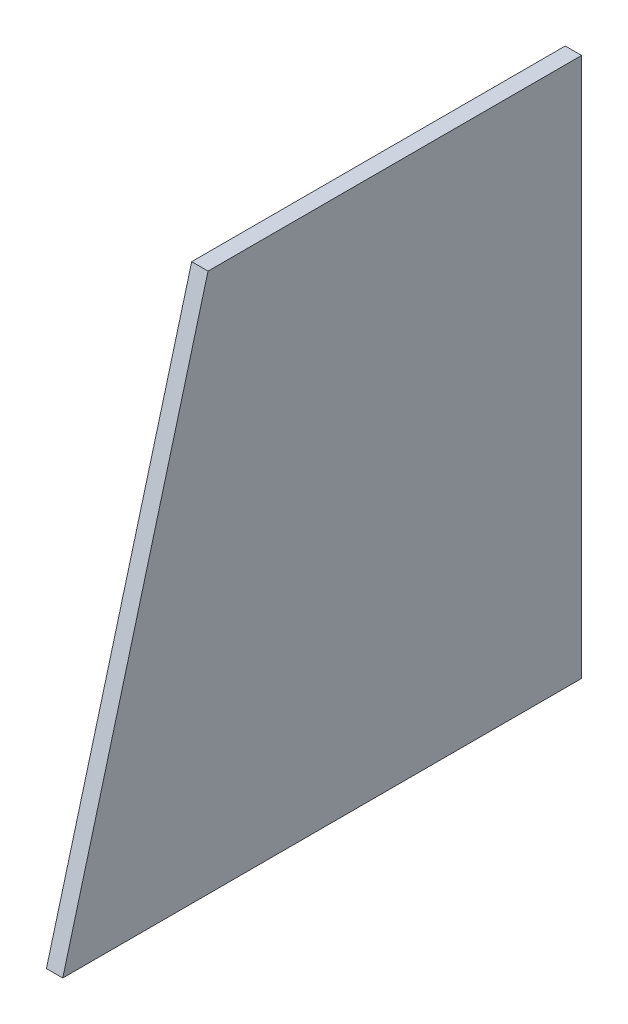
ISO-10303-21;
HEADER;
FILE_DESCRIPTION(('STEP AP214'),'2;1');
FILE_NAME('part.step','',(''),(''),'','','');
FILE_SCHEMA(('AUTOMOTIVE_DESIGN { 1 0 10303 214 1 1 1 1 }'));
ENDSEC;
DATA;
#1=APPLICATION_CONTEXT('core data for automotive mechanical design processes');
#2=APPLICATION_PROTOCOL_DEFINITION('international standard','automotive_design',2000,#1);
#3=PRODUCT_CONTEXT('',#1,'mechanical');
#4=PRODUCT('Part','Part','',(#3));
#5=PRODUCT_RELATED_PRODUCT_CATEGORY('part','',(#4));
#6=PRODUCT_DEFINITION_FORMATION('','',#4);
#7=PRODUCT_DEFINITION_CONTEXT('part definition',#1,'design');
#8=PRODUCT_DEFINITION('design','',#6,#7);
#9=PRODUCT_DEFINITION_SHAPE('','',#8);
#10=(LENGTH_UNIT() NAMED_UNIT(*) SI_UNIT(.MILLI.,.METRE.));
#11=(NAMED_UNIT(*) PLANE_ANGLE_UNIT() SI_UNIT($,.RADIAN.));
#12=(NAMED_UNIT(*) SI_UNIT($,.STERADIAN.) SOLID_ANGLE_UNIT());
#13=UNCERTAINTY_MEASURE_WITH_UNIT(LENGTH_MEASURE(1.E-05),#10,'distance_accuracy_value','');
#14=(GEOMETRIC_REPRESENTATION_CONTEXT(3) GLOBAL_UNCERTAINTY_ASSIGNED_CONTEXT((#13)) GLOBAL_UNIT_ASSIGNED_CONTEXT((#10,
#11,#12)) REPRESENTATION_CONTEXT('',''));
#15=CARTESIAN_POINT('',(0.,0.,0.));
#16=DIRECTION('',(0.,0.,1.));
#17=DIRECTION('',(1.,0.,0.));
#18=AXIS2_PLACEMENT_3D('',#15,#16,#17);
#19=CARTESIAN_POINT('',(5.,0.,-158.75));
#20=DIRECTION('',(0.,-1.,0.));
#21=DIRECTION('',(0.,0.,-1.));
#22=AXIS2_PLACEMENT_3D('',#19,#20,#21);
#23=PLANE('',#22);
#24=DIRECTION('',(0.,0.,1.));
#25=VECTOR('',#24,1.);
#26=CARTESIAN_POINT('',(0.,0.,-158.75));
#27=LINE('',#26,#25);
#28=CARTESIAN_POINT('',(0.,0.,-158.75));
#29=VERTEX_POINT('',#28);
#30=CARTESIAN_POINT('',(0.,0.,0.));
#31=VERTEX_POINT('',#30);
#32=EDGE_CURVE('E109',#29,#31,#27,.T.);
#33=ORIENTED_EDGE('',*,*,#32,.F.);
#34=DIRECTION('',(-1.,0.,0.));
#35=VECTOR('',#34,1.);
#36=CARTESIAN_POINT('',(5.,0.,-158.75));
#37=LINE('',#36,#35);
#38=CARTESIAN_POINT('',(5.,0.,-158.75));
#39=VERTEX_POINT('',#38);
#40=EDGE_CURVE('E11',#39,#29,#37,.T.);
#41=ORIENTED_EDGE('',*,*,#40,.F.);
#42=DIRECTION('',(0.,0.,1.));
#43=VECTOR('',#42,1.);
#44=CARTESIAN_POINT('',(5.,0.,-158.75));
#45=LINE('',#44,#43);
#46=CARTESIAN_POINT('',(5.,0.,0.));
#47=VERTEX_POINT('',#46);
#48=EDGE_CURVE('E101',#39,#47,#45,.T.);
#49=ORIENTED_EDGE('',*,*,#48,.T.);
#50=DIRECTION('',(-1.,0.,0.));
#51=VECTOR('',#50,1.);
#52=CARTESIAN_POINT('',(5.,0.,0.));
#53=LINE('',#52,#51);
#54=EDGE_CURVE('E42',#47,#31,#53,.T.);
#55=ORIENTED_EDGE('',*,*,#54,.T.);
#56=EDGE_LOOP('',(#33,#41,#49,#55));
#57=FACE_BOUND('',#56,.T.);
#58=ADVANCED_FACE('F39',(#57),#23,.T.);
#59=CARTESIAN_POINT('',(5.,165.1,-158.75));
#60=DIRECTION('',(0.,0.,-1.));
#61=DIRECTION('',(-1.,0.,0.));
#62=AXIS2_PLACEMENT_3D('',#59,#60,#61);
#63=PLANE('',#62);
#64=DIRECTION('',(0.,-1.,0.));
#65=VECTOR('',#64,1.);
#66=CARTESIAN_POINT('',(0.,165.1,-158.75));
#67=LINE('',#66,#65);
#68=CARTESIAN_POINT('',(0.,165.1,-158.75));
#69=VERTEX_POINT('',#68);
#70=EDGE_CURVE('E104',#69,#29,#67,.T.);
#71=ORIENTED_EDGE('',*,*,#70,.F.);
#72=DIRECTION('',(-1.,0.,0.));
#73=VECTOR('',#72,1.);
#74=CARTESIAN_POINT('',(5.,165.1,-158.75));
#75=LINE('',#74,#73);
#76=CARTESIAN_POINT('',(5.,165.1,-158.75));
#77=VERTEX_POINT('',#76);
#78=EDGE_CURVE('E49',#77,#69,#75,.T.);
#79=ORIENTED_EDGE('',*,*,#78,.F.);
#80=DIRECTION('',(0.,-1.,0.));
#81=VECTOR('',#80,1.);
#82=CARTESIAN_POINT('',(5.,165.1,-158.75));
#83=LINE('',#82,#81);
#84=EDGE_CURVE('E96',#77,#39,#83,.T.);
#85=ORIENTED_EDGE('',*,*,#84,.T.);
#86=ORIENTED_EDGE('',*,*,#40,.T.);
#87=EDGE_LOOP('',(#71,#79,#85,#86));
#88=FACE_BOUND('',#87,.T.);
#89=ADVANCED_FACE('F125',(#88),#63,.T.);
#90=CARTESIAN_POINT('',(5.,165.1,-44.45));
#91=DIRECTION('',(0.,1.,0.));
#92=DIRECTION('',(0.,0.,1.));
#93=AXIS2_PLACEMENT_3D('',#90,#91,#92);
#94=PLANE('',#93);
#95=DIRECTION('',(0.,0.,-1.));
#96=VECTOR('',#95,1.);
#97=CARTESIAN_POINT('',(0.,165.1,-44.45));
#98=LINE('',#97,#96);
#99=CARTESIAN_POINT('',(0.,165.1,-44.45));
#100=VERTEX_POINT('',#99);
#101=EDGE_CURVE('E90',#100,#69,#98,.T.);
#102=ORIENTED_EDGE('',*,*,#101,.F.);
#103=DIRECTION('',(-1.,0.,0.));
#104=VECTOR('',#103,1.);
#105=CARTESIAN_POINT('',(5.,165.1,-44.45));
#106=LINE('',#105,#104);
#107=CARTESIAN_POINT('',(5.,165.1,-44.45));
#108=VERTEX_POINT('',#107);
#109=EDGE_CURVE('E85',#108,#100,#106,.T.);
#110=ORIENTED_EDGE('',*,*,#109,.F.);
#111=DIRECTION('',(0.,0.,-1.));
#112=VECTOR('',#111,1.);
#113=CARTESIAN_POINT('',(5.,165.1,-44.45));
#114=LINE('',#113,#112);
#115=EDGE_CURVE('E88',#108,#77,#114,.T.);
#116=ORIENTED_EDGE('',*,*,#115,.T.);
#117=ORIENTED_EDGE('',*,*,#78,.T.);
#118=EDGE_LOOP('',(#102,#110,#116,#117));
#119=FACE_BOUND('',#118,.T.);
#120=ADVANCED_FACE('F87',(#119),#94,.T.);
#121=CARTESIAN_POINT('',(5.,0.,0.));
#122=DIRECTION('',(0.,0.259973473447873,0.96561575852067));
#123=DIRECTION('',(0.,-0.96561575852067,0.259973473447873));
#124=AXIS2_PLACEMENT_3D('',#121,#122,#123);
#125=PLANE('',#124);
#126=DIRECTION('',(0.,0.96561575852067,-0.259973473447873));
#127=VECTOR('',#126,1.);
#128=CARTESIAN_POINT('',(0.,0.,0.));
#129=LINE('',#128,#127);
#130=EDGE_CURVE('E113',#31,#100,#129,.T.);
#131=ORIENTED_EDGE('',*,*,#130,.F.);
#132=ORIENTED_EDGE('',*,*,#54,.F.);
#133=DIRECTION('',(0.,0.96561575852067,-0.259973473447873));
#134=VECTOR('',#133,1.);
#135=CARTESIAN_POINT('',(5.,0.,0.));
#136=LINE('',#135,#134);
#137=EDGE_CURVE('E95',#47,#108,#136,.T.);
#138=ORIENTED_EDGE('',*,*,#137,.T.);
#139=ORIENTED_EDGE('',*,*,#109,.T.);
#140=EDGE_LOOP('',(#131,#132,#138,#139));
#141=FACE_BOUND('',#140,.T.);
#142=ADVANCED_FACE('F99',(#141),#125,.T.);
#143=CARTESIAN_POINT('',(5.,0.,0.));
#144=DIRECTION('',(1.,0.,0.));
#145=DIRECTION('',(0.,0.,-1.));
#146=AXIS2_PLACEMENT_3D('',#143,#144,#145);
#147=PLANE('',#146);
#148=ORIENTED_EDGE('',*,*,#48,.F.);
#149=ORIENTED_EDGE('',*,*,#84,.F.);
#150=ORIENTED_EDGE('',*,*,#115,.F.);
#151=ORIENTED_EDGE('',*,*,#137,.F.);
#152=EDGE_LOOP('',(#148,#149,#150,#151));
#153=FACE_BOUND('',#152,.T.);
#154=ADVANCED_FACE('F94',(#153),#147,.T.);
#155=CARTESIAN_POINT('',(0.,0.,0.));
#156=DIRECTION('',(1.,0.,0.));
#157=DIRECTION('',(0.,0.,-1.));
#158=AXIS2_PLACEMENT_3D('',#155,#156,#157);
#159=PLANE('',#158);
#160=ORIENTED_EDGE('',*,*,#32,.T.);
#161=ORIENTED_EDGE('',*,*,#130,.T.);
#162=ORIENTED_EDGE('',*,*,#101,.T.);
#163=ORIENTED_EDGE('',*,*,#70,.T.);
#164=EDGE_LOOP('',(#160,#161,#162,#163));
#165=FACE_BOUND('',#164,.T.);
#166=ADVANCED_FACE('F124',(#165),#159,.F.);
#167=CLOSED_SHELL('',(#58,#89,#120,#142,#154,#166));
#168=MANIFOLD_SOLID_BREP('B2',#167);
#169=ADVANCED_BREP_SHAPE_REPRESENTATION('',(#18,#168),#14);
#170=SHAPE_DEFINITION_REPRESENTATION(#9,#169);
ENDSEC;
END-ISO-10303-21;
